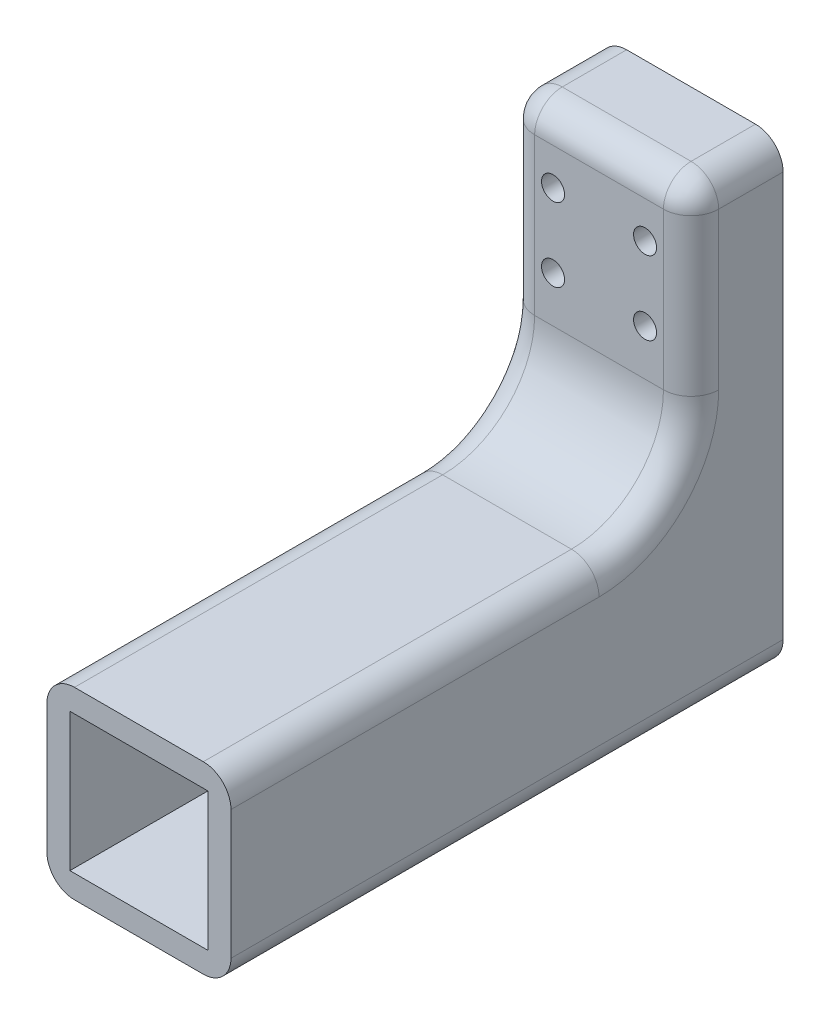
ISO-10303-21;
HEADER;
FILE_DESCRIPTION(('STEP AP214'),'2;1');
FILE_NAME('part.step','',(''),(''),'','','');
FILE_SCHEMA(('AUTOMOTIVE_DESIGN { 1 0 10303 214 1 1 1 1 }'));
ENDSEC;
DATA;
#1=APPLICATION_CONTEXT('core data for automotive mechanical design processes');
#2=APPLICATION_PROTOCOL_DEFINITION('international standard','automotive_design',2000,#1);
#3=PRODUCT_CONTEXT('',#1,'mechanical');
#4=PRODUCT('Part','Part','',(#3));
#5=PRODUCT_RELATED_PRODUCT_CATEGORY('part','',(#4));
#6=PRODUCT_DEFINITION_FORMATION('','',#4);
#7=PRODUCT_DEFINITION_CONTEXT('part definition',#1,'design');
#8=PRODUCT_DEFINITION('design','',#6,#7);
#9=PRODUCT_DEFINITION_SHAPE('','',#8);
#10=(LENGTH_UNIT() NAMED_UNIT(*) SI_UNIT(.MILLI.,.METRE.));
#11=(NAMED_UNIT(*) PLANE_ANGLE_UNIT() SI_UNIT($,.RADIAN.));
#12=(NAMED_UNIT(*) SI_UNIT($,.STERADIAN.) SOLID_ANGLE_UNIT());
#13=UNCERTAINTY_MEASURE_WITH_UNIT(LENGTH_MEASURE(1.E-05),#10,'distance_accuracy_value','');
#14=(GEOMETRIC_REPRESENTATION_CONTEXT(3) GLOBAL_UNCERTAINTY_ASSIGNED_CONTEXT((#13)) GLOBAL_UNIT_ASSIGNED_CONTEXT((#10,
#11,#12)) REPRESENTATION_CONTEXT('',''));
#15=CARTESIAN_POINT('',(0.,0.,0.));
#16=DIRECTION('',(0.,0.,1.));
#17=DIRECTION('',(1.,0.,0.));
#18=AXIS2_PLACEMENT_3D('',#15,#16,#17);
#19=CARTESIAN_POINT('',(-10.,10.,60.));
#20=DIRECTION('',(0.,-1.,0.));
#21=DIRECTION('',(0.,0.,-1.));
#22=AXIS2_PLACEMENT_3D('',#19,#20,#21);
#23=PLANE('',#22);
#24=DIRECTION('',(1.,0.,0.));
#25=VECTOR('',#24,1.);
#26=CARTESIAN_POINT('',(-10.,10.,20.));
#27=LINE('',#26,#25);
#28=CARTESIAN_POINT('',(7.,10.,20.));
#29=VERTEX_POINT('',#28);
#30=CARTESIAN_POINT('',(-7.,10.,20.));
#31=VERTEX_POINT('',#30);
#32=EDGE_CURVE('E251',#29,#31,#27,.F.);
#33=ORIENTED_EDGE('',*,*,#32,.T.);
#34=DIRECTION('',(0.,0.,-1.));
#35=VECTOR('',#34,1.);
#36=CARTESIAN_POINT('',(-7.,10.,60.));
#37=LINE('',#36,#35);
#38=CARTESIAN_POINT('',(-7.,10.,60.));
#39=VERTEX_POINT('',#38);
#40=EDGE_CURVE('E295',#31,#39,#37,.F.);
#41=ORIENTED_EDGE('',*,*,#40,.T.);
#42=DIRECTION('',(-1.,0.,0.));
#43=VECTOR('',#42,1.);
#44=CARTESIAN_POINT('',(-10.,10.,60.));
#45=LINE('',#44,#43);
#46=CARTESIAN_POINT('',(7.,10.,60.));
#47=VERTEX_POINT('',#46);
#48=EDGE_CURVE('E223',#47,#39,#45,.T.);
#49=ORIENTED_EDGE('',*,*,#48,.F.);
#50=DIRECTION('',(0.,0.,-1.));
#51=VECTOR('',#50,1.);
#52=CARTESIAN_POINT('',(7.,10.,60.));
#53=LINE('',#52,#51);
#54=EDGE_CURVE('E293',#47,#29,#53,.T.);
#55=ORIENTED_EDGE('',*,*,#54,.T.);
#56=EDGE_LOOP('',(#33,#41,#49,#55));
#57=FACE_BOUND('',#56,.T.);
#58=ADVANCED_FACE('F43',(#57),#23,.F.);
#59=CARTESIAN_POINT('',(0.,0.,60.));
#60=DIRECTION('',(0.,0.,1.));
#61=DIRECTION('',(1.,0.,0.));
#62=AXIS2_PLACEMENT_3D('',#59,#60,#61);
#63=PLANE('',#62);
#64=DIRECTION('',(1.,0.,0.));
#65=VECTOR('',#64,1.);
#66=CARTESIAN_POINT('',(-10.,-10.,60.));
#67=LINE('',#66,#65);
#68=CARTESIAN_POINT('',(-7.,-10.,60.));
#69=VERTEX_POINT('',#68);
#70=CARTESIAN_POINT('',(7.,-10.,60.));
#71=VERTEX_POINT('',#70);
#72=EDGE_CURVE('E229',#69,#71,#67,.T.);
#73=ORIENTED_EDGE('',*,*,#72,.T.);
#74=CARTESIAN_POINT('',(7.,-7.,60.));
#75=DIRECTION('',(0.,0.,1.));
#76=DIRECTION('',(1.,0.,0.));
#77=AXIS2_PLACEMENT_3D('',#74,#75,#76);
#78=CIRCLE('',#77,3.);
#79=CARTESIAN_POINT('',(10.,-7.,60.));
#80=VERTEX_POINT('',#79);
#81=EDGE_CURVE('E51',#71,#80,#78,.T.);
#82=ORIENTED_EDGE('',*,*,#81,.T.);
#83=DIRECTION('',(0.,1.,0.));
#84=VECTOR('',#83,1.);
#85=CARTESIAN_POINT('',(10.,10.,60.));
#86=LINE('',#85,#84);
#87=CARTESIAN_POINT('',(10.,7.,60.));
#88=VERTEX_POINT('',#87);
#89=EDGE_CURVE('E221',#80,#88,#86,.T.);
#90=ORIENTED_EDGE('',*,*,#89,.T.);
#91=CARTESIAN_POINT('',(7.,7.,60.));
#92=DIRECTION('',(0.,0.,1.));
#93=DIRECTION('',(1.,0.,0.));
#94=AXIS2_PLACEMENT_3D('',#91,#92,#93);
#95=CIRCLE('',#94,3.);
#96=EDGE_CURVE('E297',#88,#47,#95,.T.);
#97=ORIENTED_EDGE('',*,*,#96,.T.);
#98=ORIENTED_EDGE('',*,*,#48,.T.);
#99=CARTESIAN_POINT('',(-7.,7.,60.));
#100=DIRECTION('',(0.,0.,1.));
#101=DIRECTION('',(1.,0.,0.));
#102=AXIS2_PLACEMENT_3D('',#99,#100,#101);
#103=CIRCLE('',#102,3.);
#104=CARTESIAN_POINT('',(-10.,7.,60.));
#105=VERTEX_POINT('',#104);
#106=EDGE_CURVE('E299',#39,#105,#103,.T.);
#107=ORIENTED_EDGE('',*,*,#106,.T.);
#108=DIRECTION('',(0.,-1.,0.));
#109=VECTOR('',#108,1.);
#110=CARTESIAN_POINT('',(-10.,10.,60.));
#111=LINE('',#110,#109);
#112=CARTESIAN_POINT('',(-10.,-7.,60.));
#113=VERTEX_POINT('',#112);
#114=EDGE_CURVE('E227',#105,#113,#111,.T.);
#115=ORIENTED_EDGE('',*,*,#114,.T.);
#116=CARTESIAN_POINT('',(-7.,-7.,60.));
#117=DIRECTION('',(0.,0.,1.));
#118=DIRECTION('',(1.,0.,0.));
#119=AXIS2_PLACEMENT_3D('',#116,#117,#118);
#120=CIRCLE('',#119,3.);
#121=EDGE_CURVE('E341',#113,#69,#120,.T.);
#122=ORIENTED_EDGE('',*,*,#121,.T.);
#123=EDGE_LOOP('',(#73,#82,#90,#97,#98,#107,#115,#122));
#124=FACE_BOUND('',#123,.T.);
#125=DIRECTION('',(-1.,0.,0.));
#126=VECTOR('',#125,1.);
#127=CARTESIAN_POINT('',(-7.5,7.5,60.));
#128=LINE('',#127,#126);
#129=CARTESIAN_POINT('',(7.5,7.5,60.));
#130=VERTEX_POINT('',#129);
#131=CARTESIAN_POINT('',(-7.5,7.5,60.));
#132=VERTEX_POINT('',#131);
#133=EDGE_CURVE('E187',#130,#132,#128,.T.);
#134=ORIENTED_EDGE('',*,*,#133,.F.);
#135=DIRECTION('',(0.,1.,0.));
#136=VECTOR('',#135,1.);
#137=CARTESIAN_POINT('',(7.5,7.5,60.));
#138=LINE('',#137,#136);
#139=CARTESIAN_POINT('',(7.5,-7.5,60.));
#140=VERTEX_POINT('',#139);
#141=EDGE_CURVE('E177',#140,#130,#138,.T.);
#142=ORIENTED_EDGE('',*,*,#141,.F.);
#143=DIRECTION('',(1.,0.,0.));
#144=VECTOR('',#143,1.);
#145=CARTESIAN_POINT('',(-7.5,-7.5,60.));
#146=LINE('',#145,#144);
#147=CARTESIAN_POINT('',(-7.5,-7.5,60.));
#148=VERTEX_POINT('',#147);
#149=EDGE_CURVE('E203',#148,#140,#146,.T.);
#150=ORIENTED_EDGE('',*,*,#149,.F.);
#151=DIRECTION('',(0.,-1.,0.));
#152=VECTOR('',#151,1.);
#153=CARTESIAN_POINT('',(-7.5,7.5,60.));
#154=LINE('',#153,#152);
#155=EDGE_CURVE('E201',#132,#148,#154,.T.);
#156=ORIENTED_EDGE('',*,*,#155,.F.);
#157=EDGE_LOOP('',(#134,#142,#150,#156));
#158=FACE_BOUND('',#157,.T.);
#159=ADVANCED_FACE('F199',(#124,#158),#63,.T.);
#160=CARTESIAN_POINT('',(0.,0.,0.));
#161=DIRECTION('',(0.,0.,1.));
#162=DIRECTION('',(1.,0.,0.));
#163=AXIS2_PLACEMENT_3D('',#160,#161,#162);
#164=PLANE('',#163);
#165=CARTESIAN_POINT('',(5.,25.,0.));
#166=DIRECTION('',(0.,0.,-1.));
#167=DIRECTION('',(-1.,0.,0.));
#168=AXIS2_PLACEMENT_3D('',#165,#166,#167);
#169=CIRCLE('',#168,1.24999999999999);
#170=CARTESIAN_POINT('',(3.75000000000002,25.,0.));
#171=VERTEX_POINT('',#170);
#172=EDGE_CURVE('E248',#171,#171,#169,.T.);
#173=ORIENTED_EDGE('',*,*,#172,.F.);
#174=EDGE_LOOP('',(#173));
#175=FACE_BOUND('',#174,.T.);
#176=CARTESIAN_POINT('',(5.00000000000001,33.,0.));
#177=DIRECTION('',(0.,0.,-1.));
#178=DIRECTION('',(-1.,0.,0.));
#179=AXIS2_PLACEMENT_3D('',#176,#177,#178);
#180=CIRCLE('',#179,1.24999999999999);
#181=CARTESIAN_POINT('',(3.75000000000002,33.,0.));
#182=VERTEX_POINT('',#181);
#183=EDGE_CURVE('E244',#182,#182,#180,.T.);
#184=ORIENTED_EDGE('',*,*,#183,.F.);
#185=EDGE_LOOP('',(#184));
#186=FACE_BOUND('',#185,.T.);
#187=CARTESIAN_POINT('',(-4.99999999999999,33.,0.));
#188=DIRECTION('',(0.,0.,-1.));
#189=DIRECTION('',(-1.,0.,0.));
#190=AXIS2_PLACEMENT_3D('',#187,#188,#189);
#191=CIRCLE('',#190,1.24999999999999);
#192=CARTESIAN_POINT('',(-6.24999999999998,33.,0.));
#193=VERTEX_POINT('',#192);
#194=EDGE_CURVE('E240',#193,#193,#191,.T.);
#195=ORIENTED_EDGE('',*,*,#194,.F.);
#196=EDGE_LOOP('',(#195));
#197=FACE_BOUND('',#196,.T.);
#198=CARTESIAN_POINT('',(-5.,25.,0.));
#199=DIRECTION('',(0.,0.,-1.));
#200=DIRECTION('',(-1.,0.,0.));
#201=AXIS2_PLACEMENT_3D('',#198,#199,#200);
#202=CIRCLE('',#201,1.24999999999999);
#203=CARTESIAN_POINT('',(-6.24999999999998,25.,0.));
#204=VERTEX_POINT('',#203);
#205=EDGE_CURVE('E239',#204,#204,#202,.T.);
#206=ORIENTED_EDGE('',*,*,#205,.F.);
#207=EDGE_LOOP('',(#206));
#208=FACE_BOUND('',#207,.T.);
#209=DIRECTION('',(0.,1.,0.));
#210=VECTOR('',#209,1.);
#211=CARTESIAN_POINT('',(10.,10.,0.));
#212=LINE('',#211,#210);
#213=CARTESIAN_POINT('',(10.,-7.,0.));
#214=VERTEX_POINT('',#213);
#215=CARTESIAN_POINT('',(9.99999999999999,37.,0.));
#216=VERTEX_POINT('',#215);
#217=EDGE_CURVE('E195',#214,#216,#212,.T.);
#218=ORIENTED_EDGE('',*,*,#217,.F.);
#219=CARTESIAN_POINT('',(7.,-7.,0.));
#220=DIRECTION('',(0.,0.,1.));
#221=DIRECTION('',(1.,0.,0.));
#222=AXIS2_PLACEMENT_3D('',#219,#220,#221);
#223=CIRCLE('',#222,3.);
#224=CARTESIAN_POINT('',(7.,-10.,0.));
#225=VERTEX_POINT('',#224);
#226=EDGE_CURVE('E335',#214,#225,#223,.F.);
#227=ORIENTED_EDGE('',*,*,#226,.T.);
#228=DIRECTION('',(1.,0.,0.));
#229=VECTOR('',#228,1.);
#230=CARTESIAN_POINT('',(-10.,-10.,0.));
#231=LINE('',#230,#229);
#232=CARTESIAN_POINT('',(-7.,-10.,0.));
#233=VERTEX_POINT('',#232);
#234=EDGE_CURVE('E224',#233,#225,#231,.T.);
#235=ORIENTED_EDGE('',*,*,#234,.F.);
#236=CARTESIAN_POINT('',(-7.,-7.,0.));
#237=DIRECTION('',(0.,0.,1.));
#238=DIRECTION('',(1.,0.,0.));
#239=AXIS2_PLACEMENT_3D('',#236,#237,#238);
#240=CIRCLE('',#239,3.);
#241=CARTESIAN_POINT('',(-10.,-7.,0.));
#242=VERTEX_POINT('',#241);
#243=EDGE_CURVE('E333',#233,#242,#240,.F.);
#244=ORIENTED_EDGE('',*,*,#243,.T.);
#245=DIRECTION('',(0.,-1.,0.));
#246=VECTOR('',#245,1.);
#247=CARTESIAN_POINT('',(-10.,10.,0.));
#248=LINE('',#247,#246);
#249=CARTESIAN_POINT('',(-10.,37.,0.));
#250=VERTEX_POINT('',#249);
#251=EDGE_CURVE('E233',#250,#242,#248,.T.);
#252=ORIENTED_EDGE('',*,*,#251,.F.);
#253=CARTESIAN_POINT('',(-7.00000000000001,37.,0.));
#254=DIRECTION('',(0.,0.,1.));
#255=DIRECTION('',(1.,0.,0.));
#256=AXIS2_PLACEMENT_3D('',#253,#254,#255);
#257=CIRCLE('',#256,3.);
#258=CARTESIAN_POINT('',(-7.,40.,0.));
#259=VERTEX_POINT('',#258);
#260=EDGE_CURVE('E288',#250,#259,#257,.F.);
#261=ORIENTED_EDGE('',*,*,#260,.T.);
#262=DIRECTION('',(-1.,0.,0.));
#263=VECTOR('',#262,1.);
#264=CARTESIAN_POINT('',(10.,40.,0.));
#265=LINE('',#264,#263);
#266=CARTESIAN_POINT('',(6.99999999999999,40.,0.));
#267=VERTEX_POINT('',#266);
#268=EDGE_CURVE('E210',#267,#259,#265,.T.);
#269=ORIENTED_EDGE('',*,*,#268,.F.);
#270=CARTESIAN_POINT('',(6.99999999999999,37.,0.));
#271=DIRECTION('',(0.,0.,1.));
#272=DIRECTION('',(1.,0.,0.));
#273=AXIS2_PLACEMENT_3D('',#270,#271,#272);
#274=CIRCLE('',#273,3.);
#275=EDGE_CURVE('E290',#267,#216,#274,.F.);
#276=ORIENTED_EDGE('',*,*,#275,.T.);
#277=EDGE_LOOP('',(#218,#227,#235,#244,#252,#261,#269,#276));
#278=FACE_BOUND('',#277,.T.);
#279=DIRECTION('',(0.,1.,0.));
#280=VECTOR('',#279,1.);
#281=CARTESIAN_POINT('',(7.5,7.5,0.));
#282=LINE('',#281,#280);
#283=CARTESIAN_POINT('',(7.5,-7.5,0.));
#284=VERTEX_POINT('',#283);
#285=CARTESIAN_POINT('',(7.5,7.5,0.));
#286=VERTEX_POINT('',#285);
#287=EDGE_CURVE('E208',#284,#286,#282,.T.);
#288=ORIENTED_EDGE('',*,*,#287,.T.);
#289=DIRECTION('',(-1.,0.,0.));
#290=VECTOR('',#289,1.);
#291=CARTESIAN_POINT('',(-7.5,7.5,0.));
#292=LINE('',#291,#290);
#293=CARTESIAN_POINT('',(-7.5,7.5,0.));
#294=VERTEX_POINT('',#293);
#295=EDGE_CURVE('E194',#286,#294,#292,.T.);
#296=ORIENTED_EDGE('',*,*,#295,.T.);
#297=DIRECTION('',(0.,-1.,0.));
#298=VECTOR('',#297,1.);
#299=CARTESIAN_POINT('',(-7.5,7.5,0.));
#300=LINE('',#299,#298);
#301=CARTESIAN_POINT('',(-7.5,-7.5,0.));
#302=VERTEX_POINT('',#301);
#303=EDGE_CURVE('E212',#294,#302,#300,.T.);
#304=ORIENTED_EDGE('',*,*,#303,.T.);
#305=DIRECTION('',(1.,0.,0.));
#306=VECTOR('',#305,1.);
#307=CARTESIAN_POINT('',(-7.5,-7.5,0.));
#308=LINE('',#307,#306);
#309=EDGE_CURVE('E188',#302,#284,#308,.T.);
#310=ORIENTED_EDGE('',*,*,#309,.T.);
#311=EDGE_LOOP('',(#288,#296,#304,#310));
#312=FACE_BOUND('',#311,.T.);
#313=ADVANCED_FACE('F355',(#175,#186,#197,#208,#278,#312),#164,.F.);
#314=CARTESIAN_POINT('',(10.,10.,60.));
#315=DIRECTION('',(-1.,0.,0.));
#316=DIRECTION('',(0.,-1.,0.));
#317=AXIS2_PLACEMENT_3D('',#314,#315,#316);
#318=PLANE('',#317);
#319=ORIENTED_EDGE('',*,*,#89,.F.);
#320=DIRECTION('',(0.,0.,-1.));
#321=VECTOR('',#320,1.);
#322=CARTESIAN_POINT('',(10.,-7.,60.));
#323=LINE('',#322,#321);
#324=EDGE_CURVE('E301',#80,#214,#323,.T.);
#325=ORIENTED_EDGE('',*,*,#324,.T.);
#326=ORIENTED_EDGE('',*,*,#217,.T.);
#327=DIRECTION('',(0.,0.,-1.));
#328=VECTOR('',#327,1.);
#329=CARTESIAN_POINT('',(9.99999999999999,37.,60.));
#330=LINE('',#329,#328);
#331=CARTESIAN_POINT('',(9.99999999999999,37.,7.));
#332=VERTEX_POINT('',#331);
#333=EDGE_CURVE('E280',#216,#332,#330,.F.);
#334=ORIENTED_EDGE('',*,*,#333,.T.);
#335=DIRECTION('',(0.,1.,0.));
#336=VECTOR('',#335,1.);
#337=CARTESIAN_POINT('',(9.99999999999999,20.,7.));
#338=LINE('',#337,#336);
#339=CARTESIAN_POINT('',(9.99999999999999,20.,7.));
#340=VERTEX_POINT('',#339);
#341=EDGE_CURVE('E278',#332,#340,#338,.F.);
#342=ORIENTED_EDGE('',*,*,#341,.T.);
#343=CARTESIAN_POINT('',(9.99999999999999,20.,20.));
#344=DIRECTION('',(-1.,0.,0.));
#345=DIRECTION('',(0.,-1.,0.));
#346=AXIS2_PLACEMENT_3D('',#343,#344,#345);
#347=CIRCLE('',#346,13.);
#348=CARTESIAN_POINT('',(10.,7.,20.));
#349=VERTEX_POINT('',#348);
#350=EDGE_CURVE('E276',#340,#349,#347,.T.);
#351=ORIENTED_EDGE('',*,*,#350,.T.);
#352=DIRECTION('',(0.,0.,-1.));
#353=VECTOR('',#352,1.);
#354=CARTESIAN_POINT('',(10.,7.,60.));
#355=LINE('',#354,#353);
#356=EDGE_CURVE('E273',#349,#88,#355,.F.);
#357=ORIENTED_EDGE('',*,*,#356,.T.);
#358=EDGE_LOOP('',(#319,#325,#326,#334,#342,#351,#357));
#359=FACE_BOUND('',#358,.T.);
#360=ADVANCED_FACE('F348',(#359),#318,.F.);
#361=CARTESIAN_POINT('',(-10.,10.,60.));
#362=DIRECTION('',(1.,0.,0.));
#363=DIRECTION('',(0.,1.,0.));
#364=AXIS2_PLACEMENT_3D('',#361,#362,#363);
#365=PLANE('',#364);
#366=ORIENTED_EDGE('',*,*,#251,.T.);
#367=DIRECTION('',(0.,0.,-1.));
#368=VECTOR('',#367,1.);
#369=CARTESIAN_POINT('',(-10.,-7.,60.));
#370=LINE('',#369,#368);
#371=EDGE_CURVE('E11',#242,#113,#370,.F.);
#372=ORIENTED_EDGE('',*,*,#371,.T.);
#373=ORIENTED_EDGE('',*,*,#114,.F.);
#374=DIRECTION('',(0.,0.,-1.));
#375=VECTOR('',#374,1.);
#376=CARTESIAN_POINT('',(-10.,7.,60.));
#377=LINE('',#376,#375);
#378=CARTESIAN_POINT('',(-10.,7.,20.));
#379=VERTEX_POINT('',#378);
#380=EDGE_CURVE('E261',#105,#379,#377,.T.);
#381=ORIENTED_EDGE('',*,*,#380,.T.);
#382=CARTESIAN_POINT('',(-10.,20.,20.));
#383=DIRECTION('',(1.,0.,0.));
#384=DIRECTION('',(0.,1.,0.));
#385=AXIS2_PLACEMENT_3D('',#382,#383,#384);
#386=CIRCLE('',#385,13.);
#387=CARTESIAN_POINT('',(-10.,20.,7.));
#388=VERTEX_POINT('',#387);
#389=EDGE_CURVE('E263',#379,#388,#386,.T.);
#390=ORIENTED_EDGE('',*,*,#389,.T.);
#391=DIRECTION('',(0.,-1.,0.));
#392=VECTOR('',#391,1.);
#393=CARTESIAN_POINT('',(-10.,40.,7.));
#394=LINE('',#393,#392);
#395=CARTESIAN_POINT('',(-10.,37.,7.));
#396=VERTEX_POINT('',#395);
#397=EDGE_CURVE('E265',#388,#396,#394,.F.);
#398=ORIENTED_EDGE('',*,*,#397,.T.);
#399=DIRECTION('',(0.,0.,-1.));
#400=VECTOR('',#399,1.);
#401=CARTESIAN_POINT('',(-10.,37.,60.));
#402=LINE('',#401,#400);
#403=EDGE_CURVE('E267',#396,#250,#402,.T.);
#404=ORIENTED_EDGE('',*,*,#403,.T.);
#405=EDGE_LOOP('',(#366,#372,#373,#381,#390,#398,#404));
#406=FACE_BOUND('',#405,.T.);
#407=ADVANCED_FACE('F363',(#406),#365,.F.);
#408=CARTESIAN_POINT('',(-10.,-10.,60.));
#409=DIRECTION('',(0.,1.,0.));
#410=DIRECTION('',(0.,0.,1.));
#411=AXIS2_PLACEMENT_3D('',#408,#409,#410);
#412=PLANE('',#411);
#413=ORIENTED_EDGE('',*,*,#234,.T.);
#414=DIRECTION('',(0.,0.,-1.));
#415=VECTOR('',#414,1.);
#416=CARTESIAN_POINT('',(7.,-10.,60.));
#417=LINE('',#416,#415);
#418=EDGE_CURVE('E64',#225,#71,#417,.F.);
#419=ORIENTED_EDGE('',*,*,#418,.T.);
#420=ORIENTED_EDGE('',*,*,#72,.F.);
#421=DIRECTION('',(0.,0.,-1.));
#422=VECTOR('',#421,1.);
#423=CARTESIAN_POINT('',(-7.,-10.,60.));
#424=LINE('',#423,#422);
#425=EDGE_CURVE('E337',#69,#233,#424,.T.);
#426=ORIENTED_EDGE('',*,*,#425,.T.);
#427=EDGE_LOOP('',(#413,#419,#420,#426));
#428=FACE_BOUND('',#427,.T.);
#429=ADVANCED_FACE('F357',(#428),#412,.F.);
#430=CARTESIAN_POINT('',(7.5,7.5,60.));
#431=DIRECTION('',(-1.,0.,0.));
#432=DIRECTION('',(0.,-1.,0.));
#433=AXIS2_PLACEMENT_3D('',#430,#431,#432);
#434=PLANE('',#433);
#435=ORIENTED_EDGE('',*,*,#287,.F.);
#436=DIRECTION('',(0.,0.,-1.));
#437=VECTOR('',#436,1.);
#438=CARTESIAN_POINT('',(7.5,-7.5,60.));
#439=LINE('',#438,#437);
#440=EDGE_CURVE('E183',#140,#284,#439,.T.);
#441=ORIENTED_EDGE('',*,*,#440,.F.);
#442=ORIENTED_EDGE('',*,*,#141,.T.);
#443=DIRECTION('',(0.,0.,-1.));
#444=VECTOR('',#443,1.);
#445=CARTESIAN_POINT('',(7.5,7.5,60.));
#446=LINE('',#445,#444);
#447=EDGE_CURVE('E180',#130,#286,#446,.T.);
#448=ORIENTED_EDGE('',*,*,#447,.T.);
#449=EDGE_LOOP('',(#435,#441,#442,#448));
#450=FACE_BOUND('',#449,.T.);
#451=ADVANCED_FACE('F179',(#450),#434,.T.);
#452=CARTESIAN_POINT('',(-7.5,7.5,60.));
#453=DIRECTION('',(0.,-1.,0.));
#454=DIRECTION('',(0.,0.,-1.));
#455=AXIS2_PLACEMENT_3D('',#452,#453,#454);
#456=PLANE('',#455);
#457=ORIENTED_EDGE('',*,*,#295,.F.);
#458=ORIENTED_EDGE('',*,*,#447,.F.);
#459=ORIENTED_EDGE('',*,*,#133,.T.);
#460=DIRECTION('',(0.,0.,-1.));
#461=VECTOR('',#460,1.);
#462=CARTESIAN_POINT('',(-7.5,7.5,60.));
#463=LINE('',#462,#461);
#464=EDGE_CURVE('E196',#132,#294,#463,.T.);
#465=ORIENTED_EDGE('',*,*,#464,.T.);
#466=EDGE_LOOP('',(#457,#458,#459,#465));
#467=FACE_BOUND('',#466,.T.);
#468=ADVANCED_FACE('F191',(#467),#456,.T.);
#469=CARTESIAN_POINT('',(-7.5,7.5,60.));
#470=DIRECTION('',(1.,0.,0.));
#471=DIRECTION('',(0.,1.,0.));
#472=AXIS2_PLACEMENT_3D('',#469,#470,#471);
#473=PLANE('',#472);
#474=ORIENTED_EDGE('',*,*,#303,.F.);
#475=ORIENTED_EDGE('',*,*,#464,.F.);
#476=ORIENTED_EDGE('',*,*,#155,.T.);
#477=DIRECTION('',(0.,0.,-1.));
#478=VECTOR('',#477,1.);
#479=CARTESIAN_POINT('',(-7.5,-7.5,60.));
#480=LINE('',#479,#478);
#481=EDGE_CURVE('E218',#148,#302,#480,.T.);
#482=ORIENTED_EDGE('',*,*,#481,.T.);
#483=EDGE_LOOP('',(#474,#475,#476,#482));
#484=FACE_BOUND('',#483,.T.);
#485=ADVANCED_FACE('F701',(#484),#473,.T.);
#486=CARTESIAN_POINT('',(-7.5,-7.5,60.));
#487=DIRECTION('',(0.,1.,0.));
#488=DIRECTION('',(0.,0.,1.));
#489=AXIS2_PLACEMENT_3D('',#486,#487,#488);
#490=PLANE('',#489);
#491=ORIENTED_EDGE('',*,*,#309,.F.);
#492=ORIENTED_EDGE('',*,*,#481,.F.);
#493=ORIENTED_EDGE('',*,*,#149,.T.);
#494=ORIENTED_EDGE('',*,*,#440,.T.);
#495=EDGE_LOOP('',(#491,#492,#493,#494));
#496=FACE_BOUND('',#495,.T.);
#497=ADVANCED_FACE('F647',(#496),#490,.T.);
#498=CARTESIAN_POINT('',(10.,40.,10.));
#499=DIRECTION('',(0.,-1.,0.));
#500=DIRECTION('',(0.,0.,-1.));
#501=AXIS2_PLACEMENT_3D('',#498,#499,#500);
#502=PLANE('',#501);
#503=DIRECTION('',(-1.,0.,0.));
#504=VECTOR('',#503,1.);
#505=CARTESIAN_POINT('',(10.,40.,7.));
#506=LINE('',#505,#504);
#507=CARTESIAN_POINT('',(-7.00000000000001,40.,7.));
#508=VERTEX_POINT('',#507);
#509=CARTESIAN_POINT('',(6.99999999999999,40.,7.));
#510=VERTEX_POINT('',#509);
#511=EDGE_CURVE('E284',#508,#510,#506,.F.);
#512=ORIENTED_EDGE('',*,*,#511,.T.);
#513=DIRECTION('',(0.,0.,-1.));
#514=VECTOR('',#513,1.);
#515=CARTESIAN_POINT('',(6.99999999999999,40.,10.));
#516=LINE('',#515,#514);
#517=EDGE_CURVE('E286',#510,#267,#516,.T.);
#518=ORIENTED_EDGE('',*,*,#517,.T.);
#519=ORIENTED_EDGE('',*,*,#268,.T.);
#520=DIRECTION('',(0.,0.,-1.));
#521=VECTOR('',#520,1.);
#522=CARTESIAN_POINT('',(-7.,40.,10.));
#523=LINE('',#522,#521);
#524=EDGE_CURVE('E282',#259,#508,#523,.F.);
#525=ORIENTED_EDGE('',*,*,#524,.T.);
#526=EDGE_LOOP('',(#512,#518,#519,#525));
#527=FACE_BOUND('',#526,.T.);
#528=ADVANCED_FACE('F406',(#527),#502,.F.);
#529=CARTESIAN_POINT('',(0.,0.,10.));
#530=DIRECTION('',(0.,0.,1.));
#531=DIRECTION('',(1.,0.,0.));
#532=AXIS2_PLACEMENT_3D('',#529,#530,#531);
#533=PLANE('',#532);
#534=CARTESIAN_POINT('',(5.,25.,10.));
#535=DIRECTION('',(0.,0.,1.));
#536=DIRECTION('',(1.,0.,0.));
#537=AXIS2_PLACEMENT_3D('',#534,#535,#536);
#538=CIRCLE('',#537,1.24999999999999);
#539=CARTESIAN_POINT('',(6.24999999999999,25.,10.));
#540=VERTEX_POINT('',#539);
#541=EDGE_CURVE('E245',#540,#540,#538,.T.);
#542=ORIENTED_EDGE('',*,*,#541,.F.);
#543=EDGE_LOOP('',(#542));
#544=FACE_BOUND('',#543,.T.);
#545=CARTESIAN_POINT('',(5.00000000000001,33.,10.));
#546=DIRECTION('',(0.,0.,1.));
#547=DIRECTION('',(1.,0.,0.));
#548=AXIS2_PLACEMENT_3D('',#545,#546,#547);
#549=CIRCLE('',#548,1.24999999999999);
#550=CARTESIAN_POINT('',(6.25,33.,10.));
#551=VERTEX_POINT('',#550);
#552=EDGE_CURVE('E241',#551,#551,#549,.T.);
#553=ORIENTED_EDGE('',*,*,#552,.F.);
#554=EDGE_LOOP('',(#553));
#555=FACE_BOUND('',#554,.T.);
#556=CARTESIAN_POINT('',(-4.99999999999999,33.,10.));
#557=DIRECTION('',(0.,0.,1.));
#558=DIRECTION('',(1.,0.,0.));
#559=AXIS2_PLACEMENT_3D('',#556,#557,#558);
#560=CIRCLE('',#559,1.24999999999999);
#561=CARTESIAN_POINT('',(-3.75,33.,10.));
#562=VERTEX_POINT('',#561);
#563=EDGE_CURVE('E236',#562,#562,#560,.T.);
#564=ORIENTED_EDGE('',*,*,#563,.F.);
#565=EDGE_LOOP('',(#564));
#566=FACE_BOUND('',#565,.T.);
#567=CARTESIAN_POINT('',(-5.,25.,10.));
#568=DIRECTION('',(0.,0.,1.));
#569=DIRECTION('',(1.,0.,0.));
#570=AXIS2_PLACEMENT_3D('',#567,#568,#569);
#571=CIRCLE('',#570,1.24999999999999);
#572=CARTESIAN_POINT('',(-3.75000000000001,25.,10.));
#573=VERTEX_POINT('',#572);
#574=EDGE_CURVE('E413',#573,#573,#571,.T.);
#575=ORIENTED_EDGE('',*,*,#574,.F.);
#576=EDGE_LOOP('',(#575));
#577=FACE_BOUND('',#576,.T.);
#578=DIRECTION('',(-1.,0.,0.));
#579=VECTOR('',#578,1.);
#580=CARTESIAN_POINT('',(-10.,37.,10.));
#581=LINE('',#580,#579);
#582=CARTESIAN_POINT('',(6.99999999999999,37.,10.));
#583=VERTEX_POINT('',#582);
#584=CARTESIAN_POINT('',(-7.00000000000001,37.,10.));
#585=VERTEX_POINT('',#584);
#586=EDGE_CURVE('E254',#583,#585,#581,.T.);
#587=ORIENTED_EDGE('',*,*,#586,.T.);
#588=DIRECTION('',(0.,-1.,0.));
#589=VECTOR('',#588,1.);
#590=CARTESIAN_POINT('',(-7.,20.,10.));
#591=LINE('',#590,#589);
#592=CARTESIAN_POINT('',(-7.,20.,10.));
#593=VERTEX_POINT('',#592);
#594=EDGE_CURVE('E258',#585,#593,#591,.T.);
#595=ORIENTED_EDGE('',*,*,#594,.T.);
#596=DIRECTION('',(1.,0.,0.));
#597=VECTOR('',#596,1.);
#598=CARTESIAN_POINT('',(0.,20.,10.));
#599=LINE('',#598,#597);
#600=CARTESIAN_POINT('',(7.,20.,10.));
#601=VERTEX_POINT('',#600);
#602=EDGE_CURVE('E231',#593,#601,#599,.T.);
#603=ORIENTED_EDGE('',*,*,#602,.T.);
#604=DIRECTION('',(0.,1.,0.));
#605=VECTOR('',#604,1.);
#606=CARTESIAN_POINT('',(6.99999999999999,40.,10.));
#607=LINE('',#606,#605);
#608=EDGE_CURVE('E256',#601,#583,#607,.T.);
#609=ORIENTED_EDGE('',*,*,#608,.T.);
#610=EDGE_LOOP('',(#587,#595,#603,#609));
#611=FACE_BOUND('',#610,.T.);
#612=ADVANCED_FACE('F381',(#544,#555,#566,#577,#611),#533,.T.);
#613=CARTESIAN_POINT('',(-5.,25.,0.));
#614=DIRECTION('',(0.,0.,-1.));
#615=DIRECTION('',(-1.,0.,0.));
#616=AXIS2_PLACEMENT_3D('',#613,#614,#615);
#617=CYLINDRICAL_SURFACE('',#616,1.24999999999999);
#618=ORIENTED_EDGE('',*,*,#574,.T.);
#619=EDGE_LOOP('',(#618));
#620=FACE_BOUND('',#619,.T.);
#621=ORIENTED_EDGE('',*,*,#205,.T.);
#622=EDGE_LOOP('',(#621));
#623=FACE_BOUND('',#622,.T.);
#624=ADVANCED_FACE('F437',(#620,#623),#617,.F.);
#625=CARTESIAN_POINT('',(-4.99999999999999,33.,0.));
#626=DIRECTION('',(0.,0.,-1.));
#627=DIRECTION('',(-1.,0.,0.));
#628=AXIS2_PLACEMENT_3D('',#625,#626,#627);
#629=CYLINDRICAL_SURFACE('',#628,1.24999999999999);
#630=ORIENTED_EDGE('',*,*,#563,.T.);
#631=EDGE_LOOP('',(#630));
#632=FACE_BOUND('',#631,.T.);
#633=ORIENTED_EDGE('',*,*,#194,.T.);
#634=EDGE_LOOP('',(#633));
#635=FACE_BOUND('',#634,.T.);
#636=ADVANCED_FACE('F439',(#632,#635),#629,.F.);
#637=CARTESIAN_POINT('',(5.00000000000001,33.,0.));
#638=DIRECTION('',(0.,0.,-1.));
#639=DIRECTION('',(-1.,0.,0.));
#640=AXIS2_PLACEMENT_3D('',#637,#638,#639);
#641=CYLINDRICAL_SURFACE('',#640,1.24999999999999);
#642=ORIENTED_EDGE('',*,*,#552,.T.);
#643=EDGE_LOOP('',(#642));
#644=FACE_BOUND('',#643,.T.);
#645=ORIENTED_EDGE('',*,*,#183,.T.);
#646=EDGE_LOOP('',(#645));
#647=FACE_BOUND('',#646,.T.);
#648=ADVANCED_FACE('F446',(#644,#647),#641,.F.);
#649=CARTESIAN_POINT('',(5.,25.,0.));
#650=DIRECTION('',(0.,0.,-1.));
#651=DIRECTION('',(-1.,0.,0.));
#652=AXIS2_PLACEMENT_3D('',#649,#650,#651);
#653=CYLINDRICAL_SURFACE('',#652,1.24999999999999);
#654=ORIENTED_EDGE('',*,*,#541,.T.);
#655=EDGE_LOOP('',(#654));
#656=FACE_BOUND('',#655,.T.);
#657=ORIENTED_EDGE('',*,*,#172,.T.);
#658=EDGE_LOOP('',(#657));
#659=FACE_BOUND('',#658,.T.);
#660=ADVANCED_FACE('F426',(#656,#659),#653,.F.);
#661=CARTESIAN_POINT('',(0.,20.,20.));
#662=DIRECTION('',(1.,0.,0.));
#663=DIRECTION('',(0.,0.,-1.));
#664=AXIS2_PLACEMENT_3D('',#661,#662,#663);
#665=CYLINDRICAL_SURFACE('',#664,10.);
#666=ORIENTED_EDGE('',*,*,#602,.F.);
#667=CARTESIAN_POINT('',(-7.,20.,20.));
#668=DIRECTION('',(1.,0.,0.));
#669=DIRECTION('',(0.,1.,0.));
#670=AXIS2_PLACEMENT_3D('',#667,#668,#669);
#671=CIRCLE('',#670,10.);
#672=EDGE_CURVE('E271',#593,#31,#671,.F.);
#673=ORIENTED_EDGE('',*,*,#672,.T.);
#674=ORIENTED_EDGE('',*,*,#32,.F.);
#675=CARTESIAN_POINT('',(7.,20.,20.));
#676=DIRECTION('',(-1.,0.,0.));
#677=DIRECTION('',(0.,-1.,0.));
#678=AXIS2_PLACEMENT_3D('',#675,#676,#677);
#679=CIRCLE('',#678,10.);
#680=EDGE_CURVE('E269',#29,#601,#679,.F.);
#681=ORIENTED_EDGE('',*,*,#680,.T.);
#682=EDGE_LOOP('',(#666,#673,#674,#681));
#683=FACE_BOUND('',#682,.T.);
#684=ADVANCED_FACE('F385',(#683),#665,.F.);
#685=CARTESIAN_POINT('',(7.,7.,60.));
#686=DIRECTION('',(0.,0.,-1.));
#687=DIRECTION('',(-1.,0.,0.));
#688=AXIS2_PLACEMENT_3D('',#685,#686,#687);
#689=CYLINDRICAL_SURFACE('',#688,3.);
#690=ORIENTED_EDGE('',*,*,#96,.F.);
#691=ORIENTED_EDGE('',*,*,#356,.F.);
#692=CARTESIAN_POINT('',(7.,7.,20.));
#693=DIRECTION('',(0.,0.,-1.));
#694=DIRECTION('',(-1.,0.,0.));
#695=AXIS2_PLACEMENT_3D('',#692,#693,#694);
#696=CIRCLE('',#695,3.);
#697=EDGE_CURVE('E328',#29,#349,#696,.T.);
#698=ORIENTED_EDGE('',*,*,#697,.F.);
#699=ORIENTED_EDGE('',*,*,#54,.F.);
#700=EDGE_LOOP('',(#690,#691,#698,#699));
#701=FACE_BOUND('',#700,.T.);
#702=ADVANCED_FACE('F465',(#701),#689,.T.);
#703=CARTESIAN_POINT('',(7.,20.,20.));
#704=DIRECTION('',(-1.,0.,0.));
#705=DIRECTION('',(0.,-1.,0.));
#706=AXIS2_PLACEMENT_3D('',#703,#704,#705);
#707=TOROIDAL_SURFACE('',#706,13.,3.);
#708=ORIENTED_EDGE('',*,*,#697,.T.);
#709=ORIENTED_EDGE('',*,*,#350,.F.);
#710=CARTESIAN_POINT('',(7.,20.,7.));
#711=DIRECTION('',(0.,1.,0.));
#712=DIRECTION('',(0.,0.,1.));
#713=AXIS2_PLACEMENT_3D('',#710,#711,#712);
#714=CIRCLE('',#713,3.);
#715=EDGE_CURVE('E325',#601,#340,#714,.T.);
#716=ORIENTED_EDGE('',*,*,#715,.F.);
#717=ORIENTED_EDGE('',*,*,#680,.F.);
#718=EDGE_LOOP('',(#708,#709,#716,#717));
#719=FACE_BOUND('',#718,.T.);
#720=ADVANCED_FACE('F390',(#719),#707,.T.);
#721=CARTESIAN_POINT('',(6.99999999999999,37.,10.));
#722=DIRECTION('',(0.,0.,-1.));
#723=DIRECTION('',(-1.,0.,0.));
#724=AXIS2_PLACEMENT_3D('',#721,#722,#723);
#725=CYLINDRICAL_SURFACE('',#724,3.);
#726=ORIENTED_EDGE('',*,*,#275,.F.);
#727=ORIENTED_EDGE('',*,*,#517,.F.);
#728=CARTESIAN_POINT('',(6.99999999999999,37.,7.));
#729=DIRECTION('',(0.,0.,1.));
#730=DIRECTION('',(1.,0.,0.));
#731=AXIS2_PLACEMENT_3D('',#728,#729,#730);
#732=CIRCLE('',#731,3.);
#733=EDGE_CURVE('E322',#332,#510,#732,.T.);
#734=ORIENTED_EDGE('',*,*,#733,.F.);
#735=ORIENTED_EDGE('',*,*,#333,.F.);
#736=EDGE_LOOP('',(#726,#727,#734,#735));
#737=FACE_BOUND('',#736,.T.);
#738=ADVANCED_FACE('F411',(#737),#725,.T.);
#739=CARTESIAN_POINT('',(7.,0.,7.));
#740=DIRECTION('',(0.,-1.,0.));
#741=DIRECTION('',(1.,0.,0.));
#742=AXIS2_PLACEMENT_3D('',#739,#740,#741);
#743=CYLINDRICAL_SURFACE('',#742,3.);
#744=ORIENTED_EDGE('',*,*,#715,.T.);
#745=ORIENTED_EDGE('',*,*,#341,.F.);
#746=CARTESIAN_POINT('',(6.99999999999999,37.,7.));
#747=DIRECTION('',(0.,1.,0.));
#748=DIRECTION('',(0.,0.,1.));
#749=AXIS2_PLACEMENT_3D('',#746,#747,#748);
#750=CIRCLE('',#749,3.);
#751=EDGE_CURVE('E319',#583,#332,#750,.T.);
#752=ORIENTED_EDGE('',*,*,#751,.F.);
#753=ORIENTED_EDGE('',*,*,#608,.F.);
#754=EDGE_LOOP('',(#744,#745,#752,#753));
#755=FACE_BOUND('',#754,.T.);
#756=ADVANCED_FACE('F396',(#755),#743,.T.);
#757=CARTESIAN_POINT('',(6.99999999999999,37.,7.));
#758=DIRECTION('',(1.,0.,0.));
#759=DIRECTION('',(0.,0.,-1.));
#760=AXIS2_PLACEMENT_3D('',#757,#758,#759);
#761=SPHERICAL_SURFACE('',#760,3.);
#762=ORIENTED_EDGE('',*,*,#751,.T.);
#763=ORIENTED_EDGE('',*,*,#733,.T.);
#764=CARTESIAN_POINT('',(6.99999999999999,37.,7.));
#765=DIRECTION('',(1.,0.,0.));
#766=DIRECTION('',(0.,0.,-1.));
#767=AXIS2_PLACEMENT_3D('',#764,#765,#766);
#768=CIRCLE('',#767,3.);
#769=EDGE_CURVE('E316',#583,#510,#768,.F.);
#770=ORIENTED_EDGE('',*,*,#769,.F.);
#771=EDGE_LOOP('',(#762,#763,#770));
#772=FACE_BOUND('',#771,.T.);
#773=ADVANCED_FACE('F400',(#772),#761,.T.);
#774=CARTESIAN_POINT('',(-7.00000000000001,37.,60.));
#775=DIRECTION('',(0.,0.,-1.));
#776=DIRECTION('',(-1.,0.,0.));
#777=AXIS2_PLACEMENT_3D('',#774,#775,#776);
#778=CYLINDRICAL_SURFACE('',#777,3.);
#779=ORIENTED_EDGE('',*,*,#260,.F.);
#780=ORIENTED_EDGE('',*,*,#403,.F.);
#781=CARTESIAN_POINT('',(-7.00000000000001,37.,7.));
#782=DIRECTION('',(0.,0.,1.));
#783=DIRECTION('',(1.,0.,0.));
#784=AXIS2_PLACEMENT_3D('',#781,#782,#783);
#785=CIRCLE('',#784,3.);
#786=EDGE_CURVE('E313',#508,#396,#785,.T.);
#787=ORIENTED_EDGE('',*,*,#786,.F.);
#788=ORIENTED_EDGE('',*,*,#524,.F.);
#789=EDGE_LOOP('',(#779,#780,#787,#788));
#790=FACE_BOUND('',#789,.T.);
#791=ADVANCED_FACE('F368',(#790),#778,.T.);
#792=CARTESIAN_POINT('',(0.,37.,7.));
#793=DIRECTION('',(1.,0.,0.));
#794=DIRECTION('',(0.,0.,-1.));
#795=AXIS2_PLACEMENT_3D('',#792,#793,#794);
#796=CYLINDRICAL_SURFACE('',#795,3.);
#797=ORIENTED_EDGE('',*,*,#769,.T.);
#798=ORIENTED_EDGE('',*,*,#511,.F.);
#799=CARTESIAN_POINT('',(-7.00000000000001,37.,7.));
#800=DIRECTION('',(-1.,0.,0.));
#801=DIRECTION('',(0.,0.,1.));
#802=AXIS2_PLACEMENT_3D('',#799,#800,#801);
#803=CIRCLE('',#802,3.);
#804=EDGE_CURVE('E310',#585,#508,#803,.T.);
#805=ORIENTED_EDGE('',*,*,#804,.F.);
#806=ORIENTED_EDGE('',*,*,#586,.F.);
#807=EDGE_LOOP('',(#797,#798,#805,#806));
#808=FACE_BOUND('',#807,.T.);
#809=ADVANCED_FACE('F403',(#808),#796,.T.);
#810=CARTESIAN_POINT('',(-7.,7.,60.));
#811=DIRECTION('',(0.,0.,-1.));
#812=DIRECTION('',(-1.,0.,0.));
#813=AXIS2_PLACEMENT_3D('',#810,#811,#812);
#814=CYLINDRICAL_SURFACE('',#813,3.);
#815=ORIENTED_EDGE('',*,*,#106,.F.);
#816=ORIENTED_EDGE('',*,*,#40,.F.);
#817=CARTESIAN_POINT('',(-7.,7.,20.));
#818=DIRECTION('',(0.,0.,-1.));
#819=DIRECTION('',(-1.,0.,0.));
#820=AXIS2_PLACEMENT_3D('',#817,#818,#819);
#821=CIRCLE('',#820,3.);
#822=EDGE_CURVE('E307',#379,#31,#821,.T.);
#823=ORIENTED_EDGE('',*,*,#822,.F.);
#824=ORIENTED_EDGE('',*,*,#380,.F.);
#825=EDGE_LOOP('',(#815,#816,#823,#824));
#826=FACE_BOUND('',#825,.T.);
#827=ADVANCED_FACE('F474',(#826),#814,.T.);
#828=CARTESIAN_POINT('',(-7.00000000000001,37.,7.));
#829=DIRECTION('',(0.,1.,0.));
#830=DIRECTION('',(0.,0.,1.));
#831=AXIS2_PLACEMENT_3D('',#828,#829,#830);
#832=SPHERICAL_SURFACE('',#831,3.);
#833=ORIENTED_EDGE('',*,*,#804,.T.);
#834=ORIENTED_EDGE('',*,*,#786,.T.);
#835=CARTESIAN_POINT('',(-7.,37.,7.));
#836=DIRECTION('',(0.,1.,0.));
#837=DIRECTION('',(0.,0.,1.));
#838=AXIS2_PLACEMENT_3D('',#835,#836,#837);
#839=CIRCLE('',#838,3.);
#840=EDGE_CURVE('E304',#585,#396,#839,.F.);
#841=ORIENTED_EDGE('',*,*,#840,.F.);
#842=EDGE_LOOP('',(#833,#834,#841));
#843=FACE_BOUND('',#842,.T.);
#844=ADVANCED_FACE('F372',(#843),#832,.T.);
#845=CARTESIAN_POINT('',(-7.,20.,20.));
#846=DIRECTION('',(1.,0.,0.));
#847=DIRECTION('',(0.,1.,0.));
#848=AXIS2_PLACEMENT_3D('',#845,#846,#847);
#849=TOROIDAL_SURFACE('',#848,13.,3.);
#850=ORIENTED_EDGE('',*,*,#822,.T.);
#851=ORIENTED_EDGE('',*,*,#672,.F.);
#852=CARTESIAN_POINT('',(-7.,20.,7.));
#853=DIRECTION('',(0.,1.,0.));
#854=DIRECTION('',(0.,0.,1.));
#855=AXIS2_PLACEMENT_3D('',#852,#853,#854);
#856=CIRCLE('',#855,3.);
#857=EDGE_CURVE('E302',#388,#593,#856,.T.);
#858=ORIENTED_EDGE('',*,*,#857,.F.);
#859=ORIENTED_EDGE('',*,*,#389,.F.);
#860=EDGE_LOOP('',(#850,#851,#858,#859));
#861=FACE_BOUND('',#860,.T.);
#862=ADVANCED_FACE('F468',(#861),#849,.T.);
#863=CARTESIAN_POINT('',(-7.,0.,7.));
#864=DIRECTION('',(0.,1.,0.));
#865=DIRECTION('',(-1.,0.,0.));
#866=AXIS2_PLACEMENT_3D('',#863,#864,#865);
#867=CYLINDRICAL_SURFACE('',#866,3.);
#868=ORIENTED_EDGE('',*,*,#840,.T.);
#869=ORIENTED_EDGE('',*,*,#397,.F.);
#870=ORIENTED_EDGE('',*,*,#857,.T.);
#871=ORIENTED_EDGE('',*,*,#594,.F.);
#872=EDGE_LOOP('',(#868,#869,#870,#871));
#873=FACE_BOUND('',#872,.T.);
#874=ADVANCED_FACE('F376',(#873),#867,.T.);
#875=CARTESIAN_POINT('',(7.,-7.,60.));
#876=DIRECTION('',(0.,0.,-1.));
#877=DIRECTION('',(-1.,0.,0.));
#878=AXIS2_PLACEMENT_3D('',#875,#876,#877);
#879=CYLINDRICAL_SURFACE('',#878,3.);
#880=ORIENTED_EDGE('',*,*,#81,.F.);
#881=ORIENTED_EDGE('',*,*,#418,.F.);
#882=ORIENTED_EDGE('',*,*,#226,.F.);
#883=ORIENTED_EDGE('',*,*,#324,.F.);
#884=EDGE_LOOP('',(#880,#881,#882,#883));
#885=FACE_BOUND('',#884,.T.);
#886=ADVANCED_FACE('F352',(#885),#879,.T.);
#887=CARTESIAN_POINT('',(-7.,-7.,60.));
#888=DIRECTION('',(0.,0.,-1.));
#889=DIRECTION('',(-1.,0.,0.));
#890=AXIS2_PLACEMENT_3D('',#887,#888,#889);
#891=CYLINDRICAL_SURFACE('',#890,3.);
#892=ORIENTED_EDGE('',*,*,#121,.F.);
#893=ORIENTED_EDGE('',*,*,#371,.F.);
#894=ORIENTED_EDGE('',*,*,#243,.F.);
#895=ORIENTED_EDGE('',*,*,#425,.F.);
#896=EDGE_LOOP('',(#892,#893,#894,#895));
#897=FACE_BOUND('',#896,.T.);
#898=ADVANCED_FACE('F45',(#897),#891,.T.);
#899=CLOSED_SHELL('',(#58,#159,#313,#360,#407,#429,#451,#468,#485,#497,#528,#612,#624,#636,#648,
#660,#684,#702,#720,#738,#756,#773,#791,#809,#827,#844,#862,#874,#886,#898));
#900=MANIFOLD_SOLID_BREP('B2',#899);
#901=ADVANCED_BREP_SHAPE_REPRESENTATION('',(#18,#900),#14);
#902=SHAPE_DEFINITION_REPRESENTATION(#9,#901);
ENDSEC;
END-ISO-10303-21;
